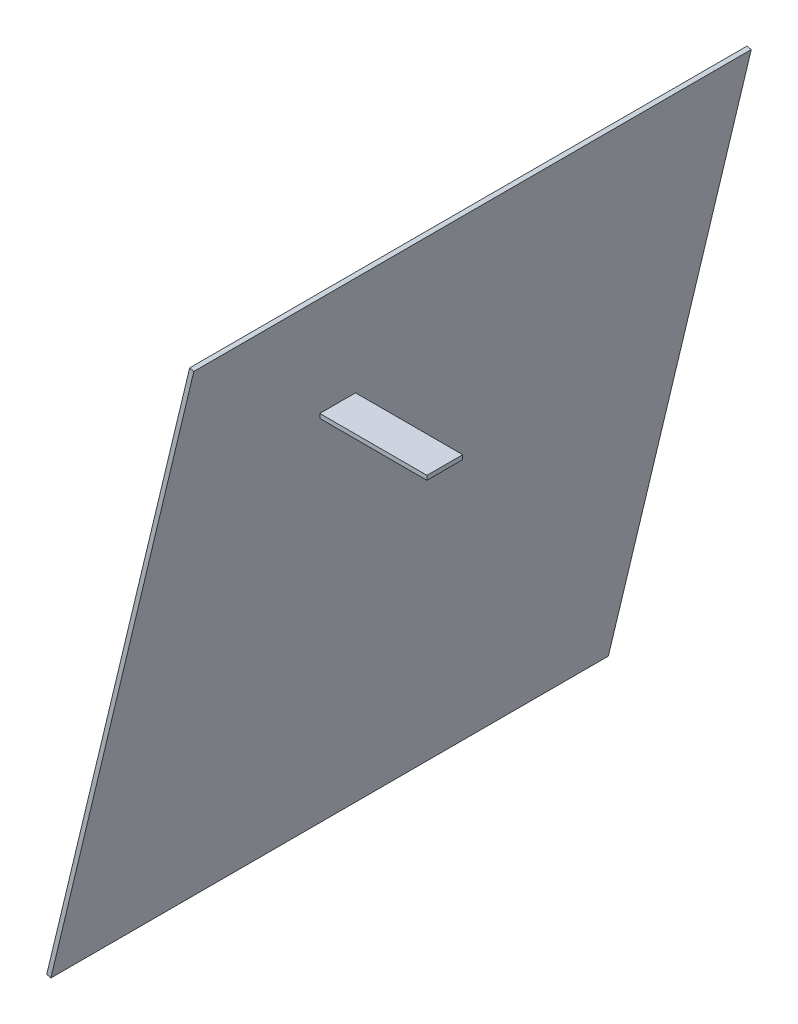
ISO-10303-21;
HEADER;
FILE_DESCRIPTION(('STEP AP214'),'2;1');
FILE_NAME('part.step','',(''),(''),'','','');
FILE_SCHEMA(('AUTOMOTIVE_DESIGN { 1 0 10303 214 1 1 1 1 }'));
ENDSEC;
DATA;
#1=APPLICATION_CONTEXT('core data for automotive mechanical design processes');
#2=APPLICATION_PROTOCOL_DEFINITION('international standard','automotive_design',2000,#1);
#3=PRODUCT_CONTEXT('',#1,'mechanical');
#4=PRODUCT('Part','Part','',(#3));
#5=PRODUCT_RELATED_PRODUCT_CATEGORY('part','',(#4));
#6=PRODUCT_DEFINITION_FORMATION('','',#4);
#7=PRODUCT_DEFINITION_CONTEXT('part definition',#1,'design');
#8=PRODUCT_DEFINITION('design','',#6,#7);
#9=PRODUCT_DEFINITION_SHAPE('','',#8);
#10=(LENGTH_UNIT() NAMED_UNIT(*) SI_UNIT(.MILLI.,.METRE.));
#11=(NAMED_UNIT(*) PLANE_ANGLE_UNIT() SI_UNIT($,.RADIAN.));
#12=(NAMED_UNIT(*) SI_UNIT($,.STERADIAN.) SOLID_ANGLE_UNIT());
#13=UNCERTAINTY_MEASURE_WITH_UNIT(LENGTH_MEASURE(1.E-05),#10,'distance_accuracy_value','');
#14=(GEOMETRIC_REPRESENTATION_CONTEXT(3) GLOBAL_UNCERTAINTY_ASSIGNED_CONTEXT((#13)) GLOBAL_UNIT_ASSIGNED_CONTEXT((#10,
#11,#12)) REPRESENTATION_CONTEXT('',''));
#15=CARTESIAN_POINT('',(0.,0.,0.));
#16=DIRECTION('',(0.,0.,1.));
#17=DIRECTION('',(1.,0.,0.));
#18=AXIS2_PLACEMENT_3D('',#15,#16,#17);
#19=CARTESIAN_POINT('',(78.1053429528928,-53.3362825802281,-111.044518300048));
#20=DIRECTION('',(1.,0.,0.));
#21=DIRECTION('',(0.,0.,-1.));
#22=AXIS2_PLACEMENT_3D('',#19,#20,#21);
#23=PLANE('',#22);
#24=DIRECTION('',(0.,0.,-1.));
#25=VECTOR('',#24,1.);
#26=CARTESIAN_POINT('',(78.1053429528928,-50.3362825802281,-111.044518300048));
#27=LINE('',#26,#25);
#28=CARTESIAN_POINT('',(78.1053429528928,-50.3362825802281,-111.044518300048));
#29=VERTEX_POINT('',#28);
#30=CARTESIAN_POINT('',(78.1053429528928,-50.3362825802281,-136.044518300048));
#31=VERTEX_POINT('',#30);
#32=EDGE_CURVE('E106',#29,#31,#27,.T.);
#33=ORIENTED_EDGE('',*,*,#32,.T.);
#34=DIRECTION('',(0.,1.,0.));
#35=VECTOR('',#34,1.);
#36=CARTESIAN_POINT('',(78.1053429528928,-53.3362825802281,-136.044518300048));
#37=LINE('',#36,#35);
#38=CARTESIAN_POINT('',(78.1053429528928,-53.3362825802281,-136.044518300048));
#39=VERTEX_POINT('',#38);
#40=EDGE_CURVE('E12',#39,#31,#37,.T.);
#41=ORIENTED_EDGE('',*,*,#40,.F.);
#42=DIRECTION('',(0.,0.,-1.));
#43=VECTOR('',#42,1.);
#44=CARTESIAN_POINT('',(78.1053429528928,-53.3362825802281,-111.044518300048));
#45=LINE('',#44,#43);
#46=CARTESIAN_POINT('',(78.1053429528928,-53.3362825802281,-111.044518300048));
#47=VERTEX_POINT('',#46);
#48=EDGE_CURVE('E94',#47,#39,#45,.T.);
#49=ORIENTED_EDGE('',*,*,#48,.F.);
#50=DIRECTION('',(0.,1.,0.));
#51=VECTOR('',#50,1.);
#52=CARTESIAN_POINT('',(78.1053429528928,-53.3362825802281,-111.044518300048));
#53=LINE('',#52,#51);
#54=EDGE_CURVE('E102',#47,#29,#53,.T.);
#55=ORIENTED_EDGE('',*,*,#54,.T.);
#56=EDGE_LOOP('',(#33,#41,#49,#55));
#57=FACE_BOUND('',#56,.T.);
#58=ADVANCED_FACE('F43',(#57),#23,.F.);
#59=CARTESIAN_POINT('',(78.1053429528928,-53.3362825802281,-136.044518300048));
#60=DIRECTION('',(0.,0.,1.));
#61=DIRECTION('',(1.,0.,0.));
#62=AXIS2_PLACEMENT_3D('',#59,#60,#61);
#63=PLANE('',#62);
#64=DIRECTION('',(1.,0.,0.));
#65=VECTOR('',#64,1.);
#66=CARTESIAN_POINT('',(78.1053429528928,-50.3362825802281,-136.044518300048));
#67=LINE('',#66,#65);
#68=CARTESIAN_POINT('',(153.105342952893,-50.3362825802281,-136.044518300048));
#69=VERTEX_POINT('',#68);
#70=EDGE_CURVE('E98',#31,#69,#67,.T.);
#71=ORIENTED_EDGE('',*,*,#70,.T.);
#72=DIRECTION('',(0.,1.,0.));
#73=VECTOR('',#72,1.);
#74=CARTESIAN_POINT('',(153.105342952893,-53.3362825802281,-136.044518300048));
#75=LINE('',#74,#73);
#76=CARTESIAN_POINT('',(153.105342952893,-53.3362825802281,-136.044518300048));
#77=VERTEX_POINT('',#76);
#78=EDGE_CURVE('E51',#77,#69,#75,.T.);
#79=ORIENTED_EDGE('',*,*,#78,.F.);
#80=DIRECTION('',(1.,0.,0.));
#81=VECTOR('',#80,1.);
#82=CARTESIAN_POINT('',(78.1053429528928,-53.3362825802281,-136.044518300048));
#83=LINE('',#82,#81);
#84=EDGE_CURVE('E89',#39,#77,#83,.T.);
#85=ORIENTED_EDGE('',*,*,#84,.F.);
#86=ORIENTED_EDGE('',*,*,#40,.T.);
#87=EDGE_LOOP('',(#71,#79,#85,#86));
#88=FACE_BOUND('',#87,.T.);
#89=ADVANCED_FACE('F97',(#88),#63,.F.);
#90=CARTESIAN_POINT('',(153.105342952893,-53.3362825802281,-111.044518300048));
#91=DIRECTION('',(-1.,0.,0.));
#92=DIRECTION('',(0.,0.,1.));
#93=AXIS2_PLACEMENT_3D('',#90,#91,#92);
#94=PLANE('',#93);
#95=DIRECTION('',(0.,0.,1.));
#96=VECTOR('',#95,1.);
#97=CARTESIAN_POINT('',(153.105342952893,-50.3362825802281,-111.044518300048));
#98=LINE('',#97,#96);
#99=CARTESIAN_POINT('',(153.105342952893,-50.3362825802281,-111.044518300048));
#100=VERTEX_POINT('',#99);
#101=EDGE_CURVE('E76',#69,#100,#98,.T.);
#102=ORIENTED_EDGE('',*,*,#101,.T.);
#103=DIRECTION('',(0.,1.,0.));
#104=VECTOR('',#103,1.);
#105=CARTESIAN_POINT('',(153.105342952893,-53.3362825802281,-111.044518300048));
#106=LINE('',#105,#104);
#107=CARTESIAN_POINT('',(153.105342952893,-53.3362825802281,-111.044518300048));
#108=VERTEX_POINT('',#107);
#109=EDGE_CURVE('E99',#108,#100,#106,.T.);
#110=ORIENTED_EDGE('',*,*,#109,.F.);
#111=DIRECTION('',(0.,0.,1.));
#112=VECTOR('',#111,1.);
#113=CARTESIAN_POINT('',(153.105342952893,-53.3362825802281,-111.044518300048));
#114=LINE('',#113,#112);
#115=EDGE_CURVE('E92',#77,#108,#114,.T.);
#116=ORIENTED_EDGE('',*,*,#115,.F.);
#117=ORIENTED_EDGE('',*,*,#78,.T.);
#118=EDGE_LOOP('',(#102,#110,#116,#117));
#119=FACE_BOUND('',#118,.T.);
#120=ADVANCED_FACE('F100',(#119),#94,.F.);
#121=CARTESIAN_POINT('',(78.1053429528928,-53.3362825802281,-111.044518300048));
#122=DIRECTION('',(0.,0.,-1.));
#123=DIRECTION('',(-1.,0.,0.));
#124=AXIS2_PLACEMENT_3D('',#121,#122,#123);
#125=PLANE('',#124);
#126=DIRECTION('',(-1.,0.,0.));
#127=VECTOR('',#126,1.);
#128=CARTESIAN_POINT('',(78.1053429528928,-50.3362825802281,-111.044518300048));
#129=LINE('',#128,#127);
#130=EDGE_CURVE('E82',#100,#29,#129,.T.);
#131=ORIENTED_EDGE('',*,*,#130,.T.);
#132=ORIENTED_EDGE('',*,*,#54,.F.);
#133=DIRECTION('',(-1.,0.,0.));
#134=VECTOR('',#133,1.);
#135=CARTESIAN_POINT('',(78.1053429528928,-53.3362825802281,-111.044518300048));
#136=LINE('',#135,#134);
#137=EDGE_CURVE('E59',#108,#47,#136,.T.);
#138=ORIENTED_EDGE('',*,*,#137,.F.);
#139=ORIENTED_EDGE('',*,*,#109,.T.);
#140=EDGE_LOOP('',(#131,#132,#138,#139));
#141=FACE_BOUND('',#140,.T.);
#142=ADVANCED_FACE('F113',(#141),#125,.F.);
#143=CARTESIAN_POINT('',(0.,-53.3362825802281,0.));
#144=DIRECTION('',(0.,-1.,0.));
#145=DIRECTION('',(0.,0.,-1.));
#146=AXIS2_PLACEMENT_3D('',#143,#144,#145);
#147=PLANE('',#146);
#148=ORIENTED_EDGE('',*,*,#48,.T.);
#149=ORIENTED_EDGE('',*,*,#84,.T.);
#150=ORIENTED_EDGE('',*,*,#115,.T.);
#151=ORIENTED_EDGE('',*,*,#137,.T.);
#152=EDGE_LOOP('',(#148,#149,#150,#151));
#153=FACE_BOUND('',#152,.T.);
#154=ADVANCED_FACE('F90',(#153),#147,.T.);
#155=CARTESIAN_POINT('',(0.,-50.3362825802281,0.));
#156=DIRECTION('',(0.,-1.,0.));
#157=DIRECTION('',(0.,0.,-1.));
#158=AXIS2_PLACEMENT_3D('',#155,#156,#157);
#159=PLANE('',#158);
#160=ORIENTED_EDGE('',*,*,#32,.F.);
#161=ORIENTED_EDGE('',*,*,#130,.F.);
#162=ORIENTED_EDGE('',*,*,#101,.F.);
#163=ORIENTED_EDGE('',*,*,#70,.F.);
#164=EDGE_LOOP('',(#160,#161,#162,#163));
#165=FACE_BOUND('',#164,.T.);
#166=ADVANCED_FACE('F116',(#165),#159,.F.);
#167=CLOSED_SHELL('',(#58,#89,#120,#142,#154,#166));
#168=MANIFOLD_SOLID_BREP('B2',#167);
#169=CARTESIAN_POINT('',(-2.91748634371541,-375.742944826707,-1.04451830004753));
#170=DIRECTION('',(0.,0.,-1.));
#171=DIRECTION('',(-1.,0.,0.));
#172=AXIS2_PLACEMENT_3D('',#169,#170,#171);
#173=PLANE('',#172);
#174=DIRECTION('',(0.232921883479864,0.972495447905127,0.));
#175=VECTOR('',#174,1.);
#176=CARTESIAN_POINT('',(0.,-376.441710477146,-1.04451830004753));
#177=LINE('',#176,#175);
#178=CARTESIAN_POINT('',(0.,-376.441710477146,-1.04451830004753));
#179=VERTEX_POINT('',#178);
#180=CARTESIAN_POINT('',(100.,41.0782895228538,-1.04451830004753));
#181=VERTEX_POINT('',#180);
#182=EDGE_CURVE('E230',#179,#181,#177,.T.);
#183=ORIENTED_EDGE('',*,*,#182,.T.);
#184=DIRECTION('',(0.972495447905127,-0.232921883479864,0.));
#185=VECTOR('',#184,1.);
#186=CARTESIAN_POINT('',(97.0825136562846,41.7770551732934,-1.04451830004753));
#187=LINE('',#186,#185);
#188=CARTESIAN_POINT('',(97.0825136562846,41.7770551732934,-1.04451830004753));
#189=VERTEX_POINT('',#188);
#190=EDGE_CURVE('E41',#189,#181,#187,.T.);
#191=ORIENTED_EDGE('',*,*,#190,.F.);
#192=DIRECTION('',(0.232921883479864,0.972495447905127,0.));
#193=VECTOR('',#192,1.);
#194=CARTESIAN_POINT('',(-2.91748634371541,-375.742944826707,-1.04451830004753));
#195=LINE('',#194,#193);
#196=CARTESIAN_POINT('',(-2.91748634371541,-375.742944826707,-1.04451830004753));
#197=VERTEX_POINT('',#196);
#198=EDGE_CURVE('E218',#197,#189,#195,.T.);
#199=ORIENTED_EDGE('',*,*,#198,.F.);
#200=DIRECTION('',(0.972495447905127,-0.232921883479864,0.));
#201=VECTOR('',#200,1.);
#202=CARTESIAN_POINT('',(-2.91748634371541,-375.742944826707,-1.04451830004753));
#203=LINE('',#202,#201);
#204=EDGE_CURVE('E226',#197,#179,#203,.T.);
#205=ORIENTED_EDGE('',*,*,#204,.T.);
#206=EDGE_LOOP('',(#183,#191,#199,#205));
#207=FACE_BOUND('',#206,.T.);
#208=ADVANCED_FACE('F167',(#207),#173,.F.);
#209=CARTESIAN_POINT('',(97.0825136562846,41.7770551732934,-1.04451830004753));
#210=DIRECTION('',(-0.232921883479864,-0.972495447905127,0.));
#211=DIRECTION('',(0.972495447905127,-0.232921883479864,0.));
#212=AXIS2_PLACEMENT_3D('',#209,#210,#211);
#213=PLANE('',#212);
#214=DIRECTION('',(0.,0.,-1.));
#215=VECTOR('',#214,1.);
#216=CARTESIAN_POINT('',(100.,41.0782895228538,-1.04451830004753));
#217=LINE('',#216,#215);
#218=CARTESIAN_POINT('',(100.,41.0782895228538,-391.044518300048));
#219=VERTEX_POINT('',#218);
#220=EDGE_CURVE('E222',#181,#219,#217,.T.);
#221=ORIENTED_EDGE('',*,*,#220,.T.);
#222=DIRECTION('',(0.972495447905127,-0.232921883479864,0.));
#223=VECTOR('',#222,1.);
#224=CARTESIAN_POINT('',(97.0825136562846,41.7770551732934,-391.044518300048));
#225=LINE('',#224,#223);
#226=CARTESIAN_POINT('',(97.0825136562846,41.7770551732934,-391.044518300048));
#227=VERTEX_POINT('',#226);
#228=EDGE_CURVE('E175',#227,#219,#225,.T.);
#229=ORIENTED_EDGE('',*,*,#228,.F.);
#230=DIRECTION('',(0.,0.,-1.));
#231=VECTOR('',#230,1.);
#232=CARTESIAN_POINT('',(97.0825136562846,41.7770551732934,-1.04451830004753));
#233=LINE('',#232,#231);
#234=EDGE_CURVE('E213',#189,#227,#233,.T.);
#235=ORIENTED_EDGE('',*,*,#234,.F.);
#236=ORIENTED_EDGE('',*,*,#190,.T.);
#237=EDGE_LOOP('',(#221,#229,#235,#236));
#238=FACE_BOUND('',#237,.T.);
#239=ADVANCED_FACE('F221',(#238),#213,.F.);
#240=CARTESIAN_POINT('',(-2.91748634371542,-375.742944826707,-391.044518300048));
#241=DIRECTION('',(0.,0.,1.));
#242=DIRECTION('',(1.,0.,0.));
#243=AXIS2_PLACEMENT_3D('',#240,#241,#242);
#244=PLANE('',#243);
#245=DIRECTION('',(-0.232921883479864,-0.972495447905127,0.));
#246=VECTOR('',#245,1.);
#247=CARTESIAN_POINT('',(0.,-376.441710477146,-391.044518300048));
#248=LINE('',#247,#246);
#249=CARTESIAN_POINT('',(0.,-376.441710477146,-391.044518300048));
#250=VERTEX_POINT('',#249);
#251=EDGE_CURVE('E200',#219,#250,#248,.T.);
#252=ORIENTED_EDGE('',*,*,#251,.T.);
#253=DIRECTION('',(0.972495447905127,-0.232921883479864,0.));
#254=VECTOR('',#253,1.);
#255=CARTESIAN_POINT('',(-2.91748634371542,-375.742944826707,-391.044518300048));
#256=LINE('',#255,#254);
#257=CARTESIAN_POINT('',(-2.91748634371542,-375.742944826707,-391.044518300048));
#258=VERTEX_POINT('',#257);
#259=EDGE_CURVE('E223',#258,#250,#256,.T.);
#260=ORIENTED_EDGE('',*,*,#259,.F.);
#261=DIRECTION('',(-0.232921883479864,-0.972495447905127,0.));
#262=VECTOR('',#261,1.);
#263=CARTESIAN_POINT('',(-2.91748634371542,-375.742944826707,-391.044518300048));
#264=LINE('',#263,#262);
#265=EDGE_CURVE('E216',#227,#258,#264,.T.);
#266=ORIENTED_EDGE('',*,*,#265,.F.);
#267=ORIENTED_EDGE('',*,*,#228,.T.);
#268=EDGE_LOOP('',(#252,#260,#266,#267));
#269=FACE_BOUND('',#268,.T.);
#270=ADVANCED_FACE('F224',(#269),#244,.F.);
#271=CARTESIAN_POINT('',(-2.91748634371541,-375.742944826707,-1.04451830004753));
#272=DIRECTION('',(0.232921883479864,0.972495447905127,0.));
#273=DIRECTION('',(-0.972495447905127,0.232921883479864,0.));
#274=AXIS2_PLACEMENT_3D('',#271,#272,#273);
#275=PLANE('',#274);
#276=DIRECTION('',(0.,0.,1.));
#277=VECTOR('',#276,1.);
#278=CARTESIAN_POINT('',(0.,-376.441710477146,-1.04451830004753));
#279=LINE('',#278,#277);
#280=EDGE_CURVE('E206',#250,#179,#279,.T.);
#281=ORIENTED_EDGE('',*,*,#280,.T.);
#282=ORIENTED_EDGE('',*,*,#204,.F.);
#283=DIRECTION('',(0.,0.,1.));
#284=VECTOR('',#283,1.);
#285=CARTESIAN_POINT('',(-2.91748634371541,-375.742944826707,-1.04451830004753));
#286=LINE('',#285,#284);
#287=EDGE_CURVE('E183',#258,#197,#286,.T.);
#288=ORIENTED_EDGE('',*,*,#287,.F.);
#289=ORIENTED_EDGE('',*,*,#259,.T.);
#290=EDGE_LOOP('',(#281,#282,#288,#289));
#291=FACE_BOUND('',#290,.T.);
#292=ADVANCED_FACE('F237',(#291),#275,.F.);
#293=CARTESIAN_POINT('',(82.352385160261,-19.7241773233045,0.));
#294=DIRECTION('',(-0.972495447905127,0.232921883479864,0.));
#295=DIRECTION('',(-0.232921883479864,-0.972495447905127,0.));
#296=AXIS2_PLACEMENT_3D('',#293,#294,#295);
#297=PLANE('',#296);
#298=ORIENTED_EDGE('',*,*,#198,.T.);
#299=ORIENTED_EDGE('',*,*,#234,.T.);
#300=ORIENTED_EDGE('',*,*,#265,.T.);
#301=ORIENTED_EDGE('',*,*,#287,.T.);
#302=EDGE_LOOP('',(#298,#299,#300,#301));
#303=FACE_BOUND('',#302,.T.);
#304=ADVANCED_FACE('F214',(#303),#297,.T.);
#305=CARTESIAN_POINT('',(85.2698715039764,-20.4229429737441,0.));
#306=DIRECTION('',(-0.972495447905127,0.232921883479864,0.));
#307=DIRECTION('',(-0.232921883479864,-0.972495447905127,0.));
#308=AXIS2_PLACEMENT_3D('',#305,#306,#307);
#309=PLANE('',#308);
#310=ORIENTED_EDGE('',*,*,#182,.F.);
#311=ORIENTED_EDGE('',*,*,#280,.F.);
#312=ORIENTED_EDGE('',*,*,#251,.F.);
#313=ORIENTED_EDGE('',*,*,#220,.F.);
#314=EDGE_LOOP('',(#310,#311,#312,#313));
#315=FACE_BOUND('',#314,.T.);
#316=ADVANCED_FACE('F240',(#315),#309,.F.);
#317=CLOSED_SHELL('',(#208,#239,#270,#292,#304,#316));
#318=MANIFOLD_SOLID_BREP('B6',#317);
#319=ADVANCED_BREP_SHAPE_REPRESENTATION('',(#18,#168,#318),#14);
#320=SHAPE_DEFINITION_REPRESENTATION(#9,#319);
ENDSEC;
END-ISO-10303-21;
